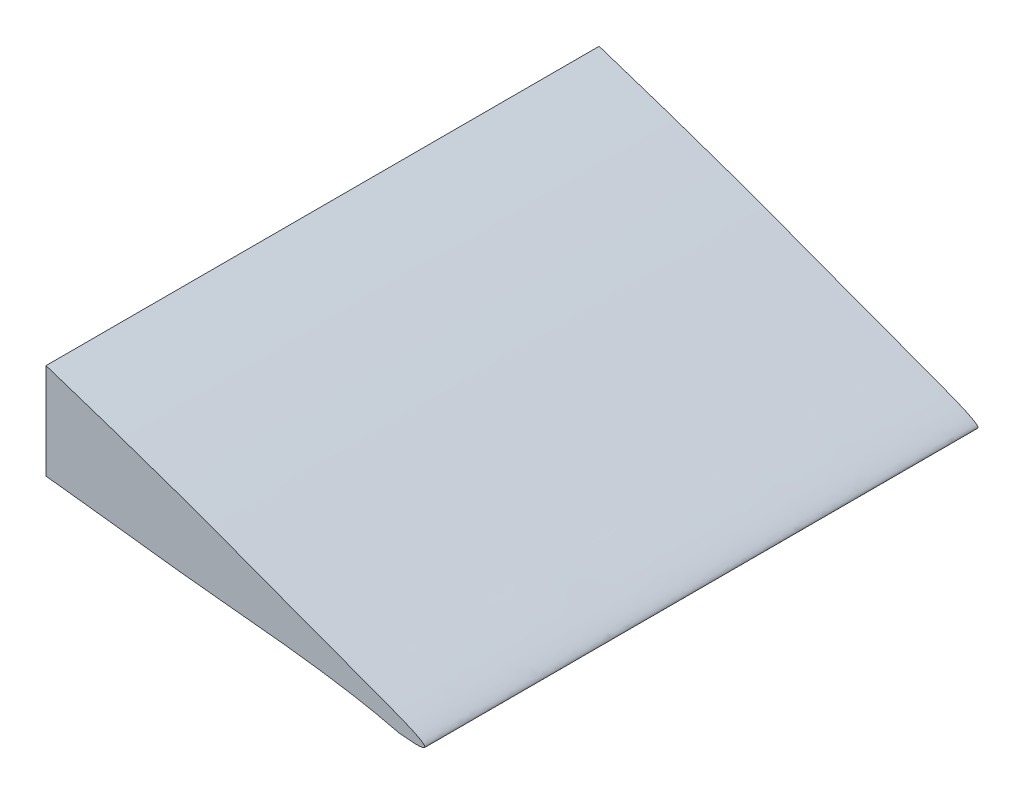
ISO-10303-21;
HEADER;
FILE_DESCRIPTION(('STEP AP214'),'2;1');
FILE_NAME('part.step','',(''),(''),'','','');
FILE_SCHEMA(('AUTOMOTIVE_DESIGN { 1 0 10303 214 1 1 1 1 }'));
ENDSEC;
DATA;
#1=APPLICATION_CONTEXT('core data for automotive mechanical design processes');
#2=APPLICATION_PROTOCOL_DEFINITION('international standard','automotive_design',2000,#1);
#3=PRODUCT_CONTEXT('',#1,'mechanical');
#4=PRODUCT('Part','Part','',(#3));
#5=PRODUCT_RELATED_PRODUCT_CATEGORY('part','',(#4));
#6=PRODUCT_DEFINITION_FORMATION('','',#4);
#7=PRODUCT_DEFINITION_CONTEXT('part definition',#1,'design');
#8=PRODUCT_DEFINITION('design','',#6,#7);
#9=PRODUCT_DEFINITION_SHAPE('','',#8);
#10=(LENGTH_UNIT() NAMED_UNIT(*) SI_UNIT(.MILLI.,.METRE.));
#11=(NAMED_UNIT(*) PLANE_ANGLE_UNIT() SI_UNIT($,.RADIAN.));
#12=(NAMED_UNIT(*) SI_UNIT($,.STERADIAN.) SOLID_ANGLE_UNIT());
#13=UNCERTAINTY_MEASURE_WITH_UNIT(LENGTH_MEASURE(1.E-05),#10,'distance_accuracy_value','');
#14=(GEOMETRIC_REPRESENTATION_CONTEXT(3) GLOBAL_UNCERTAINTY_ASSIGNED_CONTEXT((#13)) GLOBAL_UNIT_ASSIGNED_CONTEXT((#10,
#11,#12)) REPRESENTATION_CONTEXT('',''));
#15=CARTESIAN_POINT('',(0.,0.,0.));
#16=DIRECTION('',(0.,0.,1.));
#17=DIRECTION('',(1.,0.,0.));
#18=AXIS2_PLACEMENT_3D('',#15,#16,#17);
#19=CARTESIAN_POINT('',(0.000560351162113587,0.000130087070423624,47.625));
#20=CARTESIAN_POINT('',(1.23071418869678,-6.92407609127206,47.625));
#21=CARTESIAN_POINT('',(15.3166033306834,-6.18906584099094,47.625));
#22=CARTESIAN_POINT('',(36.4546728163185,-6.09849990105009,47.625));
#23=CARTESIAN_POINT('',(66.5061971849192,-0.586669106973501,47.625));
#24=CARTESIAN_POINT('',(110.497331171581,6.18149522271792,47.625));
#25=CARTESIAN_POINT('',(157.718638091679,9.03065014873911,47.625));
#26=CARTESIAN_POINT('',(205.10142463584,8.83808028186313,47.625));
#27=CARTESIAN_POINT('',(235.858814759408,7.87030619247826,47.625));
#28=CARTESIAN_POINT('',(260.846344817159,5.42741339404395,47.625));
#29=CARTESIAN_POINT('',(276.264022989737,4.51435670375389,47.625));
#30=CARTESIAN_POINT('',(293.989507544058,2.09398731346533,47.625));
#31=CARTESIAN_POINT('',(303.956832564589,1.47095520994628,47.625));
#32=CARTESIAN_POINT('',(309.846313894505,0.000130087070423666,47.625));
#33=B_SPLINE_CURVE_WITH_KNOTS('',3,(#19,#20,#21,#22,#23,#24,#25,#26,#27,#28,#29,#30,#31,#32),
.UNSPECIFIED.,.F.,.F.,(4,1,1,1,1,1,1,1,1,1,1,4),(0.,0.0569078595717698,0.106482711504673,
0.214488052979465,0.341297688349143,0.535095665520157,0.664680853556909,0.794660698192775,
0.828978881532905,0.904725108725214,0.942212919019968,1.),.UNSPECIFIED.);
#34=DIRECTION('',(0.,0.,-1.));
#35=VECTOR('',#34,1.);
#36=SURFACE_OF_LINEAR_EXTRUSION('',#33,#35);
#37=CARTESIAN_POINT('',(279.400560351162,3.963287461144,47.625));
#38=VERTEX_POINT('',#37);
#39=CARTESIAN_POINT('',(309.846313894505,0.000130087070423864,47.625));
#40=VERTEX_POINT('',#39);
#41=EDGE_CURVE('E72',#38,#40,#33,.T.);
#42=ORIENTED_EDGE('',*,*,#41,.F.);
#43=DIRECTION('',(0.,0.,-1.));
#44=VECTOR('',#43,1.);
#45=CARTESIAN_POINT('',(279.400560351162,3.96328746010702,47.625));
#46=LINE('',#45,#44);
#47=CARTESIAN_POINT('',(279.400560351162,3.963287461144,0.));
#48=VERTEX_POINT('',#47);
#49=EDGE_CURVE('E85',#38,#48,#46,.T.);
#50=ORIENTED_EDGE('',*,*,#49,.T.);
#51=CARTESIAN_POINT('',(0.000560351162113587,0.000130087070423624,0.));
#52=CARTESIAN_POINT('',(1.23071418869678,-6.92407609127206,0.));
#53=CARTESIAN_POINT('',(15.3166033306834,-6.18906584099094,0.));
#54=CARTESIAN_POINT('',(36.4546728163185,-6.09849990105009,0.));
#55=CARTESIAN_POINT('',(66.5061971849192,-0.586669106973501,0.));
#56=CARTESIAN_POINT('',(110.497331171581,6.18149522271792,0.));
#57=CARTESIAN_POINT('',(157.718638091679,9.03065014873911,0.));
#58=CARTESIAN_POINT('',(205.10142463584,8.83808028186313,0.));
#59=CARTESIAN_POINT('',(235.858814759408,7.87030619247826,0.));
#60=CARTESIAN_POINT('',(260.846344817159,5.42741339404395,0.));
#61=CARTESIAN_POINT('',(276.264022989737,4.51435670375389,0.));
#62=CARTESIAN_POINT('',(293.989507544058,2.09398731346533,0.));
#63=CARTESIAN_POINT('',(303.956832564589,1.47095520994628,0.));
#64=CARTESIAN_POINT('',(309.846313894505,0.000130087070423666,0.));
#65=B_SPLINE_CURVE_WITH_KNOTS('',3,(#51,#52,#53,#54,#55,#56,#57,#58,#59,#60,#61,#62,#63,#64),
.UNSPECIFIED.,.F.,.F.,(4,1,1,1,1,1,1,1,1,1,1,4),(0.,0.0569078595717698,0.106482711504673,
0.214488052979465,0.341297688349143,0.535095665520157,0.664680853556909,0.794660698192775,
0.828978881532905,0.904725108725214,0.942212919019968,1.),.UNSPECIFIED.);
#66=CARTESIAN_POINT('',(309.846313894505,0.000130087070423864,0.));
#67=VERTEX_POINT('',#66);
#68=EDGE_CURVE('E92',#48,#67,#65,.T.);
#69=ORIENTED_EDGE('',*,*,#68,.T.);
#70=DIRECTION('',(0.,0.,-1.));
#71=VECTOR('',#70,1.);
#72=CARTESIAN_POINT('',(309.846313894505,0.000130087070423864,47.625));
#73=LINE('',#72,#71);
#74=EDGE_CURVE('E11',#40,#67,#73,.T.);
#75=ORIENTED_EDGE('',*,*,#74,.F.);
#76=EDGE_LOOP('',(#42,#50,#69,#75));
#77=FACE_BOUND('',#76,.T.);
#78=ADVANCED_FACE('F43',(#77),#36,.F.);
#79=CARTESIAN_POINT('',(309.846313894505,0.000130087070423864,47.625));
#80=CARTESIAN_POINT('',(314.816918223261,-0.51620674157964,47.625));
#81=CARTESIAN_POINT('',(301.273197720551,4.38282813873556,47.625));
#82=CARTESIAN_POINT('',(290.359837670022,8.71099439045776,47.625));
#83=CARTESIAN_POINT('',(256.952064400645,19.5289209482833,47.625));
#84=CARTESIAN_POINT('',(217.961060472083,29.6129748944238,47.625));
#85=CARTESIAN_POINT('',(173.256699242147,40.0411042779434,47.625));
#86=CARTESIAN_POINT('',(131.400792108858,47.8848319151037,47.625));
#87=CARTESIAN_POINT('',(89.5976184754884,49.290763053775,47.625));
#88=CARTESIAN_POINT('',(52.1111282710831,42.0692152748914,47.625));
#89=CARTESIAN_POINT('',(26.2867198183782,29.9751763284633,47.625));
#90=CARTESIAN_POINT('',(8.64909202481883,17.8566051741579,47.625));
#91=CARTESIAN_POINT('',(0.810633126632263,7.35919605469637,47.625));
#92=CARTESIAN_POINT('',(0.000560351162116727,0.000130087070423829,47.625));
#93=B_SPLINE_CURVE_WITH_KNOTS('',3,(#79,#80,#81,#82,#83,#84,#85,#86,#87,#88,#89,#90,#91,#92),
.UNSPECIFIED.,.F.,.F.,(4,1,1,1,1,1,1,1,1,1,1,4),(0.,0.0239417713693992,0.070244030177139,
0.147561721425381,0.308455887006792,0.442387865106874,0.551517565626309,0.687091076796298,
0.811391258419108,0.886311735305172,0.939136382225768,1.),.UNSPECIFIED.);
#94=DIRECTION('',(0.,0.,-1.));
#95=VECTOR('',#94,1.);
#96=SURFACE_OF_LINEAR_EXTRUSION('',#93,#95);
#97=CARTESIAN_POINT('',(309.846313894505,0.000130087070423864,0.));
#98=CARTESIAN_POINT('',(314.816918223261,-0.51620674157964,0.));
#99=CARTESIAN_POINT('',(301.273197720551,4.38282813873556,0.));
#100=CARTESIAN_POINT('',(290.359837670022,8.71099439045776,0.));
#101=CARTESIAN_POINT('',(256.952064400645,19.5289209482833,0.));
#102=CARTESIAN_POINT('',(217.961060472083,29.6129748944238,0.));
#103=CARTESIAN_POINT('',(173.256699242147,40.0411042779434,0.));
#104=CARTESIAN_POINT('',(131.400792108858,47.8848319151037,0.));
#105=CARTESIAN_POINT('',(89.5976184754884,49.290763053775,0.));
#106=CARTESIAN_POINT('',(52.1111282710831,42.0692152748914,0.));
#107=CARTESIAN_POINT('',(26.2867198183782,29.9751763284633,0.));
#108=CARTESIAN_POINT('',(8.64909202481883,17.8566051741579,0.));
#109=CARTESIAN_POINT('',(0.810633126632263,7.35919605469637,0.));
#110=CARTESIAN_POINT('',(0.000560351162116727,0.000130087070423829,0.));
#111=B_SPLINE_CURVE_WITH_KNOTS('',3,(#97,#98,#99,#100,#101,#102,#103,#104,#105,#106,#107,#108,
#109,#110),.UNSPECIFIED.,.F.,.F.,(4,1,1,1,1,1,1,1,1,1,1,4),(0.,0.0239417713693992,
0.070244030177139,0.147561721425381,0.308455887006792,0.442387865106874,0.551517565626309,
0.687091076796298,0.811391258419108,0.886311735305172,0.939136382225768,1.),.UNSPECIFIED.);
#112=CARTESIAN_POINT('',(279.40056035979,12.2072210123206,0.));
#113=VERTEX_POINT('',#112);
#114=EDGE_CURVE('E99',#67,#113,#111,.T.);
#115=ORIENTED_EDGE('',*,*,#114,.T.);
#116=DIRECTION('',(0.,0.,-1.));
#117=VECTOR('',#116,1.);
#118=CARTESIAN_POINT('',(279.400560351162,12.207221015124,47.625));
#119=LINE('',#118,#117);
#120=CARTESIAN_POINT('',(279.400560351162,12.2072210123206,47.625));
#121=VERTEX_POINT('',#120);
#122=EDGE_CURVE('E62',#113,#121,#119,.F.);
#123=ORIENTED_EDGE('',*,*,#122,.T.);
#124=EDGE_CURVE('E52',#40,#121,#93,.T.);
#125=ORIENTED_EDGE('',*,*,#124,.F.);
#126=ORIENTED_EDGE('',*,*,#74,.T.);
#127=EDGE_LOOP('',(#115,#123,#125,#126));
#128=FACE_BOUND('',#127,.T.);
#129=ADVANCED_FACE('F120',(#128),#96,.F.);
#130=CARTESIAN_POINT('',(153.387816973495,8.33338198857885,47.625));
#131=DIRECTION('',(0.,0.,-1.));
#132=DIRECTION('',(-1.,0.,0.));
#133=AXIS2_PLACEMENT_3D('',#130,#131,#132);
#134=PLANE('',#133);
#135=ORIENTED_EDGE('',*,*,#124,.T.);
#136=DIRECTION('',(0.,1.,0.));
#137=VECTOR('',#136,1.);
#138=CARTESIAN_POINT('',(279.400560351162,-24.2165503945353,47.625));
#139=LINE('',#138,#137);
#140=EDGE_CURVE('E87',#38,#121,#139,.T.);
#141=ORIENTED_EDGE('',*,*,#140,.F.);
#142=ORIENTED_EDGE('',*,*,#41,.T.);
#143=EDGE_LOOP('',(#135,#141,#142));
#144=FACE_BOUND('',#143,.T.);
#145=ADVANCED_FACE('F94',(#144),#134,.F.);
#146=CARTESIAN_POINT('',(153.387816973495,8.33338198857885,0.));
#147=DIRECTION('',(0.,0.,-1.));
#148=DIRECTION('',(-1.,0.,0.));
#149=AXIS2_PLACEMENT_3D('',#146,#147,#148);
#150=PLANE('',#149);
#151=DIRECTION('',(0.,1.,0.));
#152=VECTOR('',#151,1.);
#153=CARTESIAN_POINT('',(279.400560351162,-24.2165503945353,0.));
#154=LINE('',#153,#152);
#155=EDGE_CURVE('E88',#48,#113,#154,.T.);
#156=ORIENTED_EDGE('',*,*,#155,.T.);
#157=ORIENTED_EDGE('',*,*,#114,.F.);
#158=ORIENTED_EDGE('',*,*,#68,.F.);
#159=EDGE_LOOP('',(#156,#157,#158));
#160=FACE_BOUND('',#159,.T.);
#161=ADVANCED_FACE('F124',(#160),#150,.T.);
#162=CARTESIAN_POINT('',(279.400560351162,-24.2165503945353,0.));
#163=DIRECTION('',(1.,0.,0.));
#164=DIRECTION('',(0.,0.,-1.));
#165=AXIS2_PLACEMENT_3D('',#162,#163,#164);
#166=PLANE('',#165);
#167=ORIENTED_EDGE('',*,*,#140,.T.);
#168=ORIENTED_EDGE('',*,*,#122,.F.);
#169=ORIENTED_EDGE('',*,*,#155,.F.);
#170=ORIENTED_EDGE('',*,*,#49,.F.);
#171=EDGE_LOOP('',(#167,#168,#169,#170));
#172=FACE_BOUND('',#171,.T.);
#173=ADVANCED_FACE('F86',(#172),#166,.F.);
#174=CLOSED_SHELL('',(#78,#129,#145,#161,#173));
#175=MANIFOLD_SOLID_BREP('B2',#174);
#176=ADVANCED_BREP_SHAPE_REPRESENTATION('',(#18,#175),#14);
#177=SHAPE_DEFINITION_REPRESENTATION(#9,#176);
ENDSEC;
END-ISO-10303-21;
